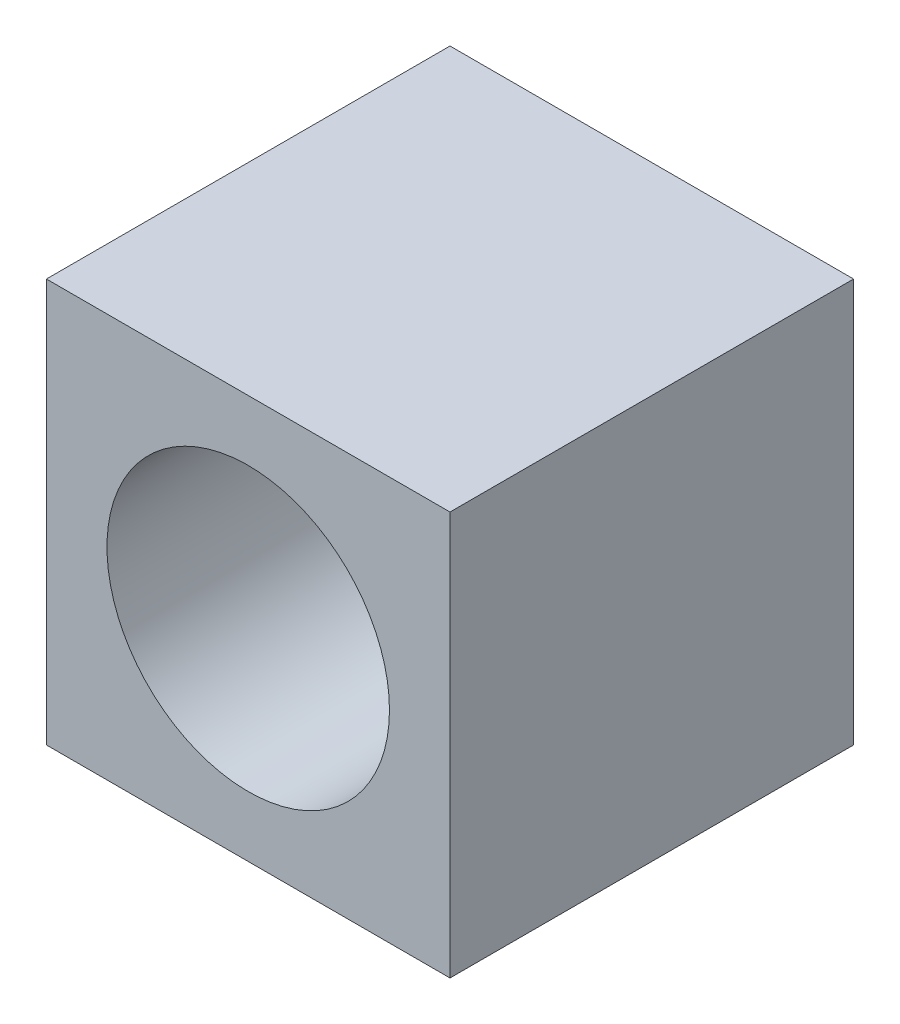
ISO-10303-21;
HEADER;
FILE_DESCRIPTION(('STEP AP214'),'2;1');
FILE_NAME('part.step','',(''),(''),'','','');
FILE_SCHEMA(('AUTOMOTIVE_DESIGN { 1 0 10303 214 1 1 1 1 }'));
ENDSEC;
DATA;
#1=APPLICATION_CONTEXT('core data for automotive mechanical design processes');
#2=APPLICATION_PROTOCOL_DEFINITION('international standard','automotive_design',2000,#1);
#3=PRODUCT_CONTEXT('',#1,'mechanical');
#4=PRODUCT('Part','Part','',(#3));
#5=PRODUCT_RELATED_PRODUCT_CATEGORY('part','',(#4));
#6=PRODUCT_DEFINITION_FORMATION('','',#4);
#7=PRODUCT_DEFINITION_CONTEXT('part definition',#1,'design');
#8=PRODUCT_DEFINITION('design','',#6,#7);
#9=PRODUCT_DEFINITION_SHAPE('','',#8);
#10=(LENGTH_UNIT() NAMED_UNIT(*) SI_UNIT(.MILLI.,.METRE.));
#11=(NAMED_UNIT(*) PLANE_ANGLE_UNIT() SI_UNIT($,.RADIAN.));
#12=(NAMED_UNIT(*) SI_UNIT($,.STERADIAN.) SOLID_ANGLE_UNIT());
#13=UNCERTAINTY_MEASURE_WITH_UNIT(LENGTH_MEASURE(1.E-05),#10,'distance_accuracy_value','');
#14=(GEOMETRIC_REPRESENTATION_CONTEXT(3) GLOBAL_UNCERTAINTY_ASSIGNED_CONTEXT((#13)) GLOBAL_UNIT_ASSIGNED_CONTEXT((#10,
#11,#12)) REPRESENTATION_CONTEXT('',''));
#15=CARTESIAN_POINT('',(0.,0.,0.));
#16=DIRECTION('',(0.,0.,1.));
#17=DIRECTION('',(1.,0.,0.));
#18=AXIS2_PLACEMENT_3D('',#15,#16,#17);
#19=CARTESIAN_POINT('',(5.,-5.,10.));
#20=DIRECTION('',(-1.,0.,0.));
#21=DIRECTION('',(0.,0.,1.));
#22=AXIS2_PLACEMENT_3D('',#19,#20,#21);
#23=PLANE('',#22);
#24=DIRECTION('',(0.,1.,0.));
#25=VECTOR('',#24,1.);
#26=CARTESIAN_POINT('',(5.,-5.,0.));
#27=LINE('',#26,#25);
#28=CARTESIAN_POINT('',(5.,-5.,0.));
#29=VERTEX_POINT('',#28);
#30=CARTESIAN_POINT('',(5.,5.,0.));
#31=VERTEX_POINT('',#30);
#32=EDGE_CURVE('E103',#29,#31,#27,.T.);
#33=ORIENTED_EDGE('',*,*,#32,.T.);
#34=DIRECTION('',(0.,0.,-1.));
#35=VECTOR('',#34,1.);
#36=CARTESIAN_POINT('',(5.,5.,10.));
#37=LINE('',#36,#35);
#38=CARTESIAN_POINT('',(5.,5.,10.));
#39=VERTEX_POINT('',#38);
#40=EDGE_CURVE('E11',#39,#31,#37,.T.);
#41=ORIENTED_EDGE('',*,*,#40,.F.);
#42=DIRECTION('',(0.,1.,0.));
#43=VECTOR('',#42,1.);
#44=CARTESIAN_POINT('',(5.,-5.,10.));
#45=LINE('',#44,#43);
#46=CARTESIAN_POINT('',(5.,-5.,10.));
#47=VERTEX_POINT('',#46);
#48=EDGE_CURVE('E91',#47,#39,#45,.T.);
#49=ORIENTED_EDGE('',*,*,#48,.F.);
#50=DIRECTION('',(0.,0.,-1.));
#51=VECTOR('',#50,1.);
#52=CARTESIAN_POINT('',(5.,-5.,10.));
#53=LINE('',#52,#51);
#54=EDGE_CURVE('E99',#47,#29,#53,.T.);
#55=ORIENTED_EDGE('',*,*,#54,.T.);
#56=EDGE_LOOP('',(#33,#41,#49,#55));
#57=FACE_BOUND('',#56,.T.);
#58=ADVANCED_FACE('F40',(#57),#23,.F.);
#59=CARTESIAN_POINT('',(-5.,5.,10.));
#60=DIRECTION('',(0.,-1.,0.));
#61=DIRECTION('',(0.,0.,-1.));
#62=AXIS2_PLACEMENT_3D('',#59,#60,#61);
#63=PLANE('',#62);
#64=DIRECTION('',(-1.,0.,0.));
#65=VECTOR('',#64,1.);
#66=CARTESIAN_POINT('',(-5.,5.,0.));
#67=LINE('',#66,#65);
#68=CARTESIAN_POINT('',(-5.,5.,0.));
#69=VERTEX_POINT('',#68);
#70=EDGE_CURVE('E95',#31,#69,#67,.T.);
#71=ORIENTED_EDGE('',*,*,#70,.T.);
#72=DIRECTION('',(0.,0.,-1.));
#73=VECTOR('',#72,1.);
#74=CARTESIAN_POINT('',(-5.,5.,10.));
#75=LINE('',#74,#73);
#76=CARTESIAN_POINT('',(-5.,5.,10.));
#77=VERTEX_POINT('',#76);
#78=EDGE_CURVE('E48',#77,#69,#75,.T.);
#79=ORIENTED_EDGE('',*,*,#78,.F.);
#80=DIRECTION('',(-1.,0.,0.));
#81=VECTOR('',#80,1.);
#82=CARTESIAN_POINT('',(-5.,5.,10.));
#83=LINE('',#82,#81);
#84=EDGE_CURVE('E86',#39,#77,#83,.T.);
#85=ORIENTED_EDGE('',*,*,#84,.F.);
#86=ORIENTED_EDGE('',*,*,#40,.T.);
#87=EDGE_LOOP('',(#71,#79,#85,#86));
#88=FACE_BOUND('',#87,.T.);
#89=ADVANCED_FACE('F94',(#88),#63,.F.);
#90=CARTESIAN_POINT('',(-5.,-5.,10.));
#91=DIRECTION('',(1.,0.,0.));
#92=DIRECTION('',(0.,0.,-1.));
#93=AXIS2_PLACEMENT_3D('',#90,#91,#92);
#94=PLANE('',#93);
#95=DIRECTION('',(0.,-1.,0.));
#96=VECTOR('',#95,1.);
#97=CARTESIAN_POINT('',(-5.,-5.,0.));
#98=LINE('',#97,#96);
#99=CARTESIAN_POINT('',(-5.,-5.,0.));
#100=VERTEX_POINT('',#99);
#101=EDGE_CURVE('E73',#69,#100,#98,.T.);
#102=ORIENTED_EDGE('',*,*,#101,.T.);
#103=DIRECTION('',(0.,0.,-1.));
#104=VECTOR('',#103,1.);
#105=CARTESIAN_POINT('',(-5.,-5.,10.));
#106=LINE('',#105,#104);
#107=CARTESIAN_POINT('',(-5.,-5.,10.));
#108=VERTEX_POINT('',#107);
#109=EDGE_CURVE('E96',#108,#100,#106,.T.);
#110=ORIENTED_EDGE('',*,*,#109,.F.);
#111=DIRECTION('',(0.,-1.,0.));
#112=VECTOR('',#111,1.);
#113=CARTESIAN_POINT('',(-5.,-5.,10.));
#114=LINE('',#113,#112);
#115=EDGE_CURVE('E89',#77,#108,#114,.T.);
#116=ORIENTED_EDGE('',*,*,#115,.F.);
#117=ORIENTED_EDGE('',*,*,#78,.T.);
#118=EDGE_LOOP('',(#102,#110,#116,#117));
#119=FACE_BOUND('',#118,.T.);
#120=ADVANCED_FACE('F97',(#119),#94,.F.);
#121=CARTESIAN_POINT('',(-5.,-5.,10.));
#122=DIRECTION('',(0.,1.,0.));
#123=DIRECTION('',(0.,0.,1.));
#124=AXIS2_PLACEMENT_3D('',#121,#122,#123);
#125=PLANE('',#124);
#126=DIRECTION('',(1.,0.,0.));
#127=VECTOR('',#126,1.);
#128=CARTESIAN_POINT('',(-5.,-5.,0.));
#129=LINE('',#128,#127);
#130=EDGE_CURVE('E79',#100,#29,#129,.T.);
#131=ORIENTED_EDGE('',*,*,#130,.T.);
#132=ORIENTED_EDGE('',*,*,#54,.F.);
#133=DIRECTION('',(1.,0.,0.));
#134=VECTOR('',#133,1.);
#135=CARTESIAN_POINT('',(-5.,-5.,10.));
#136=LINE('',#135,#134);
#137=EDGE_CURVE('E56',#108,#47,#136,.T.);
#138=ORIENTED_EDGE('',*,*,#137,.F.);
#139=ORIENTED_EDGE('',*,*,#109,.T.);
#140=EDGE_LOOP('',(#131,#132,#138,#139));
#141=FACE_BOUND('',#140,.T.);
#142=ADVANCED_FACE('F111',(#141),#125,.F.);
#143=CARTESIAN_POINT('',(0.,0.,10.));
#144=DIRECTION('',(0.,0.,-1.));
#145=DIRECTION('',(-1.,0.,0.));
#146=AXIS2_PLACEMENT_3D('',#143,#144,#145);
#147=PLANE('',#146);
#148=CARTESIAN_POINT('',(0.,0.,10.));
#149=DIRECTION('',(0.,0.,1.));
#150=DIRECTION('',(1.,0.,0.));
#151=AXIS2_PLACEMENT_3D('',#148,#149,#150);
#152=CIRCLE('',#151,3.5);
#153=CARTESIAN_POINT('',(3.5,0.,10.));
#154=VERTEX_POINT('',#153);
#155=EDGE_CURVE('E117',#154,#154,#152,.T.);
#156=ORIENTED_EDGE('',*,*,#155,.F.);
#157=EDGE_LOOP('',(#156));
#158=FACE_BOUND('',#157,.T.);
#159=ORIENTED_EDGE('',*,*,#48,.T.);
#160=ORIENTED_EDGE('',*,*,#84,.T.);
#161=ORIENTED_EDGE('',*,*,#115,.T.);
#162=ORIENTED_EDGE('',*,*,#137,.T.);
#163=EDGE_LOOP('',(#159,#160,#161,#162));
#164=FACE_BOUND('',#163,.T.);
#165=ADVANCED_FACE('F87',(#158,#164),#147,.F.);
#166=CARTESIAN_POINT('',(0.,0.,0.));
#167=DIRECTION('',(0.,0.,-1.));
#168=DIRECTION('',(-1.,0.,0.));
#169=AXIS2_PLACEMENT_3D('',#166,#167,#168);
#170=PLANE('',#169);
#171=ORIENTED_EDGE('',*,*,#32,.F.);
#172=ORIENTED_EDGE('',*,*,#130,.F.);
#173=ORIENTED_EDGE('',*,*,#101,.F.);
#174=ORIENTED_EDGE('',*,*,#70,.F.);
#175=EDGE_LOOP('',(#171,#172,#173,#174));
#176=FACE_BOUND('',#175,.T.);
#177=ADVANCED_FACE('F114',(#176),#170,.T.);
#178=CARTESIAN_POINT('',(0.,0.,5.));
#179=DIRECTION('',(0.,0.,1.));
#180=DIRECTION('',(1.,0.,0.));
#181=AXIS2_PLACEMENT_3D('',#178,#179,#180);
#182=CYLINDRICAL_SURFACE('',#181,3.5);
#183=CARTESIAN_POINT('',(0.,0.,5.));
#184=DIRECTION('',(0.,0.,1.));
#185=DIRECTION('',(1.,0.,0.));
#186=AXIS2_PLACEMENT_3D('',#183,#184,#185);
#187=CIRCLE('',#186,3.5);
#188=CARTESIAN_POINT('',(3.5,0.,5.));
#189=VERTEX_POINT('',#188);
#190=EDGE_CURVE('E106',#189,#189,#187,.T.);
#191=ORIENTED_EDGE('',*,*,#190,.F.);
#192=EDGE_LOOP('',(#191));
#193=FACE_BOUND('',#192,.T.);
#194=ORIENTED_EDGE('',*,*,#155,.T.);
#195=EDGE_LOOP('',(#194));
#196=FACE_BOUND('',#195,.T.);
#197=ADVANCED_FACE('F125',(#193,#196),#182,.F.);
#198=CARTESIAN_POINT('',(0.,0.,5.));
#199=DIRECTION('',(0.,0.,1.));
#200=DIRECTION('',(1.,0.,0.));
#201=AXIS2_PLACEMENT_3D('',#198,#199,#200);
#202=PLANE('',#201);
#203=ORIENTED_EDGE('',*,*,#190,.T.);
#204=EDGE_LOOP('',(#203));
#205=FACE_BOUND('',#204,.T.);
#206=ADVANCED_FACE('F123',(#205),#202,.T.);
#207=CLOSED_SHELL('',(#58,#89,#120,#142,#165,#177,#197,#206));
#208=MANIFOLD_SOLID_BREP('B2',#207);
#209=ADVANCED_BREP_SHAPE_REPRESENTATION('',(#18,#208),#14);
#210=SHAPE_DEFINITION_REPRESENTATION(#9,#209);
ENDSEC;
END-ISO-10303-21;
